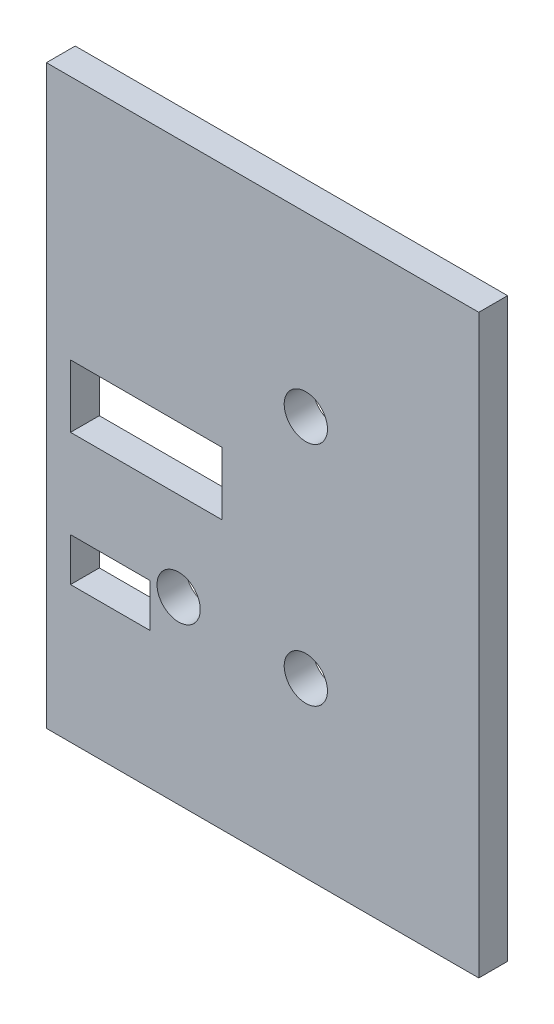
ISO-10303-21;
HEADER;
FILE_DESCRIPTION(('STEP AP214'),'2;1');
FILE_NAME('part.step','',(''),(''),'','','');
FILE_SCHEMA(('AUTOMOTIVE_DESIGN { 1 0 10303 214 1 1 1 1 }'));
ENDSEC;
DATA;
#1=APPLICATION_CONTEXT('core data for automotive mechanical design processes');
#2=APPLICATION_PROTOCOL_DEFINITION('international standard','automotive_design',2000,#1);
#3=PRODUCT_CONTEXT('',#1,'mechanical');
#4=PRODUCT('Part','Part','',(#3));
#5=PRODUCT_RELATED_PRODUCT_CATEGORY('part','',(#4));
#6=PRODUCT_DEFINITION_FORMATION('','',#4);
#7=PRODUCT_DEFINITION_CONTEXT('part definition',#1,'design');
#8=PRODUCT_DEFINITION('design','',#6,#7);
#9=PRODUCT_DEFINITION_SHAPE('','',#8);
#10=(LENGTH_UNIT() NAMED_UNIT(*) SI_UNIT(.MILLI.,.METRE.));
#11=(NAMED_UNIT(*) PLANE_ANGLE_UNIT() SI_UNIT($,.RADIAN.));
#12=(NAMED_UNIT(*) SI_UNIT($,.STERADIAN.) SOLID_ANGLE_UNIT());
#13=UNCERTAINTY_MEASURE_WITH_UNIT(LENGTH_MEASURE(1.E-05),#10,'distance_accuracy_value','');
#14=(GEOMETRIC_REPRESENTATION_CONTEXT(3) GLOBAL_UNCERTAINTY_ASSIGNED_CONTEXT((#13)) GLOBAL_UNIT_ASSIGNED_CONTEXT((#10,
#11,#12)) REPRESENTATION_CONTEXT('',''));
#15=CARTESIAN_POINT('',(0.,0.,0.));
#16=DIRECTION('',(0.,0.,1.));
#17=DIRECTION('',(1.,0.,0.));
#18=AXIS2_PLACEMENT_3D('',#15,#16,#17);
#19=CARTESIAN_POINT('',(0.,0.,2.));
#20=DIRECTION('',(0.,0.,1.));
#21=DIRECTION('',(1.,0.,0.));
#22=AXIS2_PLACEMENT_3D('',#19,#20,#21);
#23=PLANE('',#22);
#24=CARTESIAN_POINT('',(3.,-8.00000000000001,2.));
#25=DIRECTION('',(0.,0.,1.));
#26=DIRECTION('',(1.,0.,0.));
#27=AXIS2_PLACEMENT_3D('',#24,#25,#26);
#28=CIRCLE('',#27,1.5);
#29=CARTESIAN_POINT('',(4.5,-8.00000000000001,2.));
#30=VERTEX_POINT('',#29);
#31=EDGE_CURVE('E324',#30,#30,#28,.T.);
#32=ORIENTED_EDGE('',*,*,#31,.F.);
#33=EDGE_LOOP('',(#32));
#34=FACE_BOUND('',#33,.T.);
#35=CARTESIAN_POINT('',(3.,7.72999999999999,2.));
#36=DIRECTION('',(0.,0.,1.));
#37=DIRECTION('',(1.,0.,0.));
#38=AXIS2_PLACEMENT_3D('',#35,#36,#37);
#39=CIRCLE('',#38,1.5);
#40=CARTESIAN_POINT('',(4.5,7.72999999999999,2.));
#41=VERTEX_POINT('',#40);
#42=EDGE_CURVE('E149',#41,#41,#39,.T.);
#43=ORIENTED_EDGE('',*,*,#42,.F.);
#44=EDGE_LOOP('',(#43));
#45=FACE_BOUND('',#44,.T.);
#46=DIRECTION('',(0.,1.,0.));
#47=VECTOR('',#46,1.);
#48=CARTESIAN_POINT('',(-7.82520706053083,0.,2.));
#49=LINE('',#48,#47);
#50=CARTESIAN_POINT('',(-7.82520706053083,-10.5227139770063,2.));
#51=VERTEX_POINT('',#50);
#52=CARTESIAN_POINT('',(-7.82520706053083,-7.52271397700631,2.));
#53=VERTEX_POINT('',#52);
#54=EDGE_CURVE('E56',#51,#53,#49,.T.);
#55=ORIENTED_EDGE('',*,*,#54,.F.);
#56=DIRECTION('',(-1.,0.,0.));
#57=VECTOR('',#56,1.);
#58=CARTESIAN_POINT('',(0.,-10.5227139770063,2.));
#59=LINE('',#58,#57);
#60=CARTESIAN_POINT('',(-13.3252070605308,-10.5227139770063,2.));
#61=VERTEX_POINT('',#60);
#62=EDGE_CURVE('E143',#51,#61,#59,.T.);
#63=ORIENTED_EDGE('',*,*,#62,.T.);
#64=DIRECTION('',(0.,1.,0.));
#65=VECTOR('',#64,1.);
#66=CARTESIAN_POINT('',(-13.3252070605308,0.,2.));
#67=LINE('',#66,#65);
#68=CARTESIAN_POINT('',(-13.3252070605308,-7.52271397700631,2.));
#69=VERTEX_POINT('',#68);
#70=EDGE_CURVE('E146',#61,#69,#67,.T.);
#71=ORIENTED_EDGE('',*,*,#70,.T.);
#72=DIRECTION('',(-1.,0.,0.));
#73=VECTOR('',#72,1.);
#74=CARTESIAN_POINT('',(0.,-7.52271397700631,2.));
#75=LINE('',#74,#73);
#76=EDGE_CURVE('E155',#53,#69,#75,.T.);
#77=ORIENTED_EDGE('',*,*,#76,.F.);
#78=EDGE_LOOP('',(#55,#63,#71,#77));
#79=FACE_BOUND('',#78,.T.);
#80=CARTESIAN_POINT('',(-5.82520706053083,-7.52271397700631,2.));
#81=DIRECTION('',(0.,0.,1.));
#82=DIRECTION('',(1.,0.,0.));
#83=AXIS2_PLACEMENT_3D('',#80,#81,#82);
#84=CIRCLE('',#83,1.5);
#85=CARTESIAN_POINT('',(-4.32520706053083,-7.52271397700631,2.));
#86=VERTEX_POINT('',#85);
#87=EDGE_CURVE('E162',#86,#86,#84,.T.);
#88=ORIENTED_EDGE('',*,*,#87,.F.);
#89=EDGE_LOOP('',(#88));
#90=FACE_BOUND('',#89,.T.);
#91=DIRECTION('',(0.,-1.,0.));
#92=VECTOR('',#91,1.);
#93=CARTESIAN_POINT('',(-15.,-20.,2.));
#94=LINE('',#93,#92);
#95=CARTESIAN_POINT('',(-15.,20.,2.));
#96=VERTEX_POINT('',#95);
#97=CARTESIAN_POINT('',(-15.,-20.,2.));
#98=VERTEX_POINT('',#97);
#99=EDGE_CURVE('E200',#96,#98,#94,.T.);
#100=ORIENTED_EDGE('',*,*,#99,.T.);
#101=DIRECTION('',(1.,0.,0.));
#102=VECTOR('',#101,1.);
#103=CARTESIAN_POINT('',(15.,-20.,2.));
#104=LINE('',#103,#102);
#105=CARTESIAN_POINT('',(15.,-20.,2.));
#106=VERTEX_POINT('',#105);
#107=EDGE_CURVE('E203',#98,#106,#104,.T.);
#108=ORIENTED_EDGE('',*,*,#107,.T.);
#109=DIRECTION('',(0.,1.,0.));
#110=VECTOR('',#109,1.);
#111=CARTESIAN_POINT('',(15.,-20.,2.));
#112=LINE('',#111,#110);
#113=CARTESIAN_POINT('',(15.,20.,2.));
#114=VERTEX_POINT('',#113);
#115=EDGE_CURVE('E206',#106,#114,#112,.T.);
#116=ORIENTED_EDGE('',*,*,#115,.T.);
#117=DIRECTION('',(-1.,0.,0.));
#118=VECTOR('',#117,1.);
#119=CARTESIAN_POINT('',(15.,20.,2.));
#120=LINE('',#119,#118);
#121=EDGE_CURVE('E208',#114,#96,#120,.T.);
#122=ORIENTED_EDGE('',*,*,#121,.T.);
#123=EDGE_LOOP('',(#100,#108,#116,#122));
#124=FACE_BOUND('',#123,.T.);
#125=DIRECTION('',(0.,1.,0.));
#126=VECTOR('',#125,1.);
#127=CARTESIAN_POINT('',(-2.82520706053083,0.,2.));
#128=LINE('',#127,#126);
#129=CARTESIAN_POINT('',(-2.82520706053083,-1.37627288425088,2.));
#130=VERTEX_POINT('',#129);
#131=CARTESIAN_POINT('',(-2.82520706053083,2.97728602299369,2.));
#132=VERTEX_POINT('',#131);
#133=EDGE_CURVE('E179',#130,#132,#128,.T.);
#134=ORIENTED_EDGE('',*,*,#133,.F.);
#135=DIRECTION('',(-1.,0.,0.));
#136=VECTOR('',#135,1.);
#137=CARTESIAN_POINT('',(0.,-1.37627288425087,2.));
#138=LINE('',#137,#136);
#139=CARTESIAN_POINT('',(-13.3252070605308,-1.37627288425088,2.));
#140=VERTEX_POINT('',#139);
#141=EDGE_CURVE('E48',#130,#140,#138,.T.);
#142=ORIENTED_EDGE('',*,*,#141,.T.);
#143=DIRECTION('',(0.,1.,0.));
#144=VECTOR('',#143,1.);
#145=CARTESIAN_POINT('',(-13.3252070605308,0.,2.));
#146=LINE('',#145,#144);
#147=CARTESIAN_POINT('',(-13.3252070605308,2.97728602299369,2.));
#148=VERTEX_POINT('',#147);
#149=EDGE_CURVE('E169',#140,#148,#146,.T.);
#150=ORIENTED_EDGE('',*,*,#149,.T.);
#151=DIRECTION('',(-1.,0.,0.));
#152=VECTOR('',#151,1.);
#153=CARTESIAN_POINT('',(0.,2.97728602299369,2.));
#154=LINE('',#153,#152);
#155=EDGE_CURVE('E183',#132,#148,#154,.T.);
#156=ORIENTED_EDGE('',*,*,#155,.F.);
#157=EDGE_LOOP('',(#134,#142,#150,#156));
#158=FACE_BOUND('',#157,.T.);
#159=ADVANCED_FACE('F33',(#34,#45,#79,#90,#124,#158),#23,.T.);
#160=CARTESIAN_POINT('',(0.,0.,0.));
#161=DIRECTION('',(0.,0.,1.));
#162=DIRECTION('',(1.,0.,0.));
#163=AXIS2_PLACEMENT_3D('',#160,#161,#162);
#164=PLANE('',#163);
#165=CARTESIAN_POINT('',(3.,-8.00000000000001,0.));
#166=DIRECTION('',(0.,0.,1.));
#167=DIRECTION('',(1.,0.,0.));
#168=AXIS2_PLACEMENT_3D('',#165,#166,#167);
#169=CIRCLE('',#168,1.5);
#170=CARTESIAN_POINT('',(4.5,-8.00000000000001,0.));
#171=VERTEX_POINT('',#170);
#172=EDGE_CURVE('E180',#171,#171,#169,.T.);
#173=ORIENTED_EDGE('',*,*,#172,.T.);
#174=EDGE_LOOP('',(#173));
#175=FACE_BOUND('',#174,.T.);
#176=CARTESIAN_POINT('',(3.,7.72999999999999,0.));
#177=DIRECTION('',(0.,0.,1.));
#178=DIRECTION('',(1.,0.,0.));
#179=AXIS2_PLACEMENT_3D('',#176,#177,#178);
#180=CIRCLE('',#179,1.5);
#181=CARTESIAN_POINT('',(4.5,7.72999999999999,0.));
#182=VERTEX_POINT('',#181);
#183=EDGE_CURVE('E325',#182,#182,#180,.T.);
#184=ORIENTED_EDGE('',*,*,#183,.T.);
#185=EDGE_LOOP('',(#184));
#186=FACE_BOUND('',#185,.T.);
#187=DIRECTION('',(0.,-1.,0.));
#188=VECTOR('',#187,1.);
#189=CARTESIAN_POINT('',(-15.,-20.,0.));
#190=LINE('',#189,#188);
#191=CARTESIAN_POINT('',(-15.,20.,0.));
#192=VERTEX_POINT('',#191);
#193=CARTESIAN_POINT('',(-15.,-20.,0.));
#194=VERTEX_POINT('',#193);
#195=EDGE_CURVE('E197',#192,#194,#190,.T.);
#196=ORIENTED_EDGE('',*,*,#195,.F.);
#197=DIRECTION('',(-1.,0.,0.));
#198=VECTOR('',#197,1.);
#199=CARTESIAN_POINT('',(15.,20.,0.));
#200=LINE('',#199,#198);
#201=CARTESIAN_POINT('',(15.,20.,0.));
#202=VERTEX_POINT('',#201);
#203=EDGE_CURVE('E204',#202,#192,#200,.T.);
#204=ORIENTED_EDGE('',*,*,#203,.F.);
#205=DIRECTION('',(0.,1.,0.));
#206=VECTOR('',#205,1.);
#207=CARTESIAN_POINT('',(15.,-20.,0.));
#208=LINE('',#207,#206);
#209=CARTESIAN_POINT('',(15.,-20.,0.));
#210=VERTEX_POINT('',#209);
#211=EDGE_CURVE('E215',#210,#202,#208,.T.);
#212=ORIENTED_EDGE('',*,*,#211,.F.);
#213=DIRECTION('',(1.,0.,0.));
#214=VECTOR('',#213,1.);
#215=CARTESIAN_POINT('',(15.,-20.,0.));
#216=LINE('',#215,#214);
#217=EDGE_CURVE('E213',#194,#210,#216,.T.);
#218=ORIENTED_EDGE('',*,*,#217,.F.);
#219=EDGE_LOOP('',(#196,#204,#212,#218));
#220=FACE_BOUND('',#219,.T.);
#221=CARTESIAN_POINT('',(-5.82520706053083,-7.52271397700631,0.));
#222=DIRECTION('',(0.,0.,1.));
#223=DIRECTION('',(1.,0.,0.));
#224=AXIS2_PLACEMENT_3D('',#221,#222,#223);
#225=CIRCLE('',#224,1.5);
#226=CARTESIAN_POINT('',(-4.32520706053083,-7.52271397700631,0.));
#227=VERTEX_POINT('',#226);
#228=EDGE_CURVE('E194',#227,#227,#225,.T.);
#229=ORIENTED_EDGE('',*,*,#228,.T.);
#230=EDGE_LOOP('',(#229));
#231=FACE_BOUND('',#230,.T.);
#232=DIRECTION('',(-1.,0.,0.));
#233=VECTOR('',#232,1.);
#234=CARTESIAN_POINT('',(0.,-10.5227139770063,0.));
#235=LINE('',#234,#233);
#236=CARTESIAN_POINT('',(-7.82520706053083,-10.5227139770063,0.));
#237=VERTEX_POINT('',#236);
#238=CARTESIAN_POINT('',(-13.3252070605308,-10.5227139770063,0.));
#239=VERTEX_POINT('',#238);
#240=EDGE_CURVE('E131',#237,#239,#235,.T.);
#241=ORIENTED_EDGE('',*,*,#240,.F.);
#242=DIRECTION('',(0.,1.,0.));
#243=VECTOR('',#242,1.);
#244=CARTESIAN_POINT('',(-7.82520706053083,0.,0.));
#245=LINE('',#244,#243);
#246=CARTESIAN_POINT('',(-7.82520706053083,-7.52271397700631,0.));
#247=VERTEX_POINT('',#246);
#248=EDGE_CURVE('E125',#237,#247,#245,.T.);
#249=ORIENTED_EDGE('',*,*,#248,.T.);
#250=DIRECTION('',(-1.,0.,0.));
#251=VECTOR('',#250,1.);
#252=CARTESIAN_POINT('',(0.,-7.52271397700631,0.));
#253=LINE('',#252,#251);
#254=CARTESIAN_POINT('',(-13.3252070605308,-7.52271397700631,0.));
#255=VERTEX_POINT('',#254);
#256=EDGE_CURVE('E134',#247,#255,#253,.T.);
#257=ORIENTED_EDGE('',*,*,#256,.T.);
#258=DIRECTION('',(0.,1.,0.));
#259=VECTOR('',#258,1.);
#260=CARTESIAN_POINT('',(-13.3252070605308,0.,0.));
#261=LINE('',#260,#259);
#262=EDGE_CURVE('E139',#239,#255,#261,.T.);
#263=ORIENTED_EDGE('',*,*,#262,.F.);
#264=EDGE_LOOP('',(#241,#249,#257,#263));
#265=FACE_BOUND('',#264,.T.);
#266=DIRECTION('',(-1.,0.,0.));
#267=VECTOR('',#266,1.);
#268=CARTESIAN_POINT('',(0.,-1.37627288425087,0.));
#269=LINE('',#268,#267);
#270=CARTESIAN_POINT('',(-2.82520706053083,-1.37627288425088,0.));
#271=VERTEX_POINT('',#270);
#272=CARTESIAN_POINT('',(-13.3252070605308,-1.37627288425088,0.));
#273=VERTEX_POINT('',#272);
#274=EDGE_CURVE('E166',#271,#273,#269,.T.);
#275=ORIENTED_EDGE('',*,*,#274,.F.);
#276=DIRECTION('',(0.,1.,0.));
#277=VECTOR('',#276,1.);
#278=CARTESIAN_POINT('',(-2.82520706053083,0.,0.));
#279=LINE('',#278,#277);
#280=CARTESIAN_POINT('',(-2.82520706053083,2.97728602299369,0.));
#281=VERTEX_POINT('',#280);
#282=EDGE_CURVE('E168',#271,#281,#279,.T.);
#283=ORIENTED_EDGE('',*,*,#282,.T.);
#284=DIRECTION('',(-1.,0.,0.));
#285=VECTOR('',#284,1.);
#286=CARTESIAN_POINT('',(0.,2.97728602299369,0.));
#287=LINE('',#286,#285);
#288=CARTESIAN_POINT('',(-13.3252070605308,2.97728602299369,0.));
#289=VERTEX_POINT('',#288);
#290=EDGE_CURVE('E172',#281,#289,#287,.T.);
#291=ORIENTED_EDGE('',*,*,#290,.T.);
#292=DIRECTION('',(0.,1.,0.));
#293=VECTOR('',#292,1.);
#294=CARTESIAN_POINT('',(-13.3252070605308,0.,0.));
#295=LINE('',#294,#293);
#296=EDGE_CURVE('E175',#273,#289,#295,.T.);
#297=ORIENTED_EDGE('',*,*,#296,.F.);
#298=EDGE_LOOP('',(#275,#283,#291,#297));
#299=FACE_BOUND('',#298,.T.);
#300=ADVANCED_FACE('F141',(#175,#186,#220,#231,#265,#299),#164,.F.);
#301=CARTESIAN_POINT('',(-15.,-20.,2.));
#302=DIRECTION('',(1.,0.,0.));
#303=DIRECTION('',(0.,1.,0.));
#304=AXIS2_PLACEMENT_3D('',#301,#302,#303);
#305=PLANE('',#304);
#306=ORIENTED_EDGE('',*,*,#195,.T.);
#307=DIRECTION('',(0.,0.,-1.));
#308=VECTOR('',#307,1.);
#309=CARTESIAN_POINT('',(-15.,-20.,2.));
#310=LINE('',#309,#308);
#311=EDGE_CURVE('E11',#98,#194,#310,.T.);
#312=ORIENTED_EDGE('',*,*,#311,.F.);
#313=ORIENTED_EDGE('',*,*,#99,.F.);
#314=DIRECTION('',(0.,0.,-1.));
#315=VECTOR('',#314,1.);
#316=CARTESIAN_POINT('',(-15.,20.,2.));
#317=LINE('',#316,#315);
#318=EDGE_CURVE('E210',#96,#192,#317,.T.);
#319=ORIENTED_EDGE('',*,*,#318,.T.);
#320=EDGE_LOOP('',(#306,#312,#313,#319));
#321=FACE_BOUND('',#320,.T.);
#322=ADVANCED_FACE('F35',(#321),#305,.F.);
#323=CARTESIAN_POINT('',(15.,-20.,2.));
#324=DIRECTION('',(0.,1.,0.));
#325=DIRECTION('',(-1.,0.,0.));
#326=AXIS2_PLACEMENT_3D('',#323,#324,#325);
#327=PLANE('',#326);
#328=ORIENTED_EDGE('',*,*,#217,.T.);
#329=DIRECTION('',(0.,0.,-1.));
#330=VECTOR('',#329,1.);
#331=CARTESIAN_POINT('',(15.,-20.,2.));
#332=LINE('',#331,#330);
#333=EDGE_CURVE('E41',#106,#210,#332,.T.);
#334=ORIENTED_EDGE('',*,*,#333,.F.);
#335=ORIENTED_EDGE('',*,*,#107,.F.);
#336=ORIENTED_EDGE('',*,*,#311,.T.);
#337=EDGE_LOOP('',(#328,#334,#335,#336));
#338=FACE_BOUND('',#337,.T.);
#339=ADVANCED_FACE('F243',(#338),#327,.F.);
#340=CARTESIAN_POINT('',(15.,-20.,2.));
#341=DIRECTION('',(-1.,0.,0.));
#342=DIRECTION('',(0.,-1.,0.));
#343=AXIS2_PLACEMENT_3D('',#340,#341,#342);
#344=PLANE('',#343);
#345=ORIENTED_EDGE('',*,*,#211,.T.);
#346=DIRECTION('',(0.,0.,-1.));
#347=VECTOR('',#346,1.);
#348=CARTESIAN_POINT('',(15.,20.,2.));
#349=LINE('',#348,#347);
#350=EDGE_CURVE('E220',#114,#202,#349,.T.);
#351=ORIENTED_EDGE('',*,*,#350,.F.);
#352=ORIENTED_EDGE('',*,*,#115,.F.);
#353=ORIENTED_EDGE('',*,*,#333,.T.);
#354=EDGE_LOOP('',(#345,#351,#352,#353));
#355=FACE_BOUND('',#354,.T.);
#356=ADVANCED_FACE('F227',(#355),#344,.F.);
#357=CARTESIAN_POINT('',(15.,20.,2.));
#358=DIRECTION('',(0.,-1.,0.));
#359=DIRECTION('',(0.,0.,-1.));
#360=AXIS2_PLACEMENT_3D('',#357,#358,#359);
#361=PLANE('',#360);
#362=ORIENTED_EDGE('',*,*,#203,.T.);
#363=ORIENTED_EDGE('',*,*,#318,.F.);
#364=ORIENTED_EDGE('',*,*,#121,.F.);
#365=ORIENTED_EDGE('',*,*,#350,.T.);
#366=EDGE_LOOP('',(#362,#363,#364,#365));
#367=FACE_BOUND('',#366,.T.);
#368=ADVANCED_FACE('F236',(#367),#361,.F.);
#369=CARTESIAN_POINT('',(-5.82520706053083,-7.52271397700631,0.));
#370=DIRECTION('',(0.,0.,1.));
#371=DIRECTION('',(1.,0.,0.));
#372=AXIS2_PLACEMENT_3D('',#369,#370,#371);
#373=CYLINDRICAL_SURFACE('',#372,1.5);
#374=ORIENTED_EDGE('',*,*,#228,.F.);
#375=EDGE_LOOP('',(#374));
#376=FACE_BOUND('',#375,.T.);
#377=ORIENTED_EDGE('',*,*,#87,.T.);
#378=EDGE_LOOP('',(#377));
#379=FACE_BOUND('',#378,.T.);
#380=ADVANCED_FACE('F261',(#376,#379),#373,.F.);
#381=CARTESIAN_POINT('',(-7.82520706053083,0.,0.));
#382=DIRECTION('',(1.,0.,0.));
#383=DIRECTION('',(0.,0.,-1.));
#384=AXIS2_PLACEMENT_3D('',#381,#382,#383);
#385=PLANE('',#384);
#386=ORIENTED_EDGE('',*,*,#54,.T.);
#387=DIRECTION('',(0.,0.,1.));
#388=VECTOR('',#387,1.);
#389=CARTESIAN_POINT('',(-7.82520706053083,-7.52271397700631,0.));
#390=LINE('',#389,#388);
#391=EDGE_CURVE('E121',#247,#53,#390,.T.);
#392=ORIENTED_EDGE('',*,*,#391,.F.);
#393=ORIENTED_EDGE('',*,*,#248,.F.);
#394=DIRECTION('',(0.,0.,1.));
#395=VECTOR('',#394,1.);
#396=CARTESIAN_POINT('',(-7.82520706053083,-10.5227139770063,0.));
#397=LINE('',#396,#395);
#398=EDGE_CURVE('E160',#237,#51,#397,.T.);
#399=ORIENTED_EDGE('',*,*,#398,.T.);
#400=EDGE_LOOP('',(#386,#392,#393,#399));
#401=FACE_BOUND('',#400,.T.);
#402=ADVANCED_FACE('F123',(#401),#385,.F.);
#403=CARTESIAN_POINT('',(0.,-10.5227139770063,0.));
#404=DIRECTION('',(0.,1.,0.));
#405=DIRECTION('',(-1.,0.,0.));
#406=AXIS2_PLACEMENT_3D('',#403,#404,#405);
#407=PLANE('',#406);
#408=ORIENTED_EDGE('',*,*,#62,.F.);
#409=ORIENTED_EDGE('',*,*,#398,.F.);
#410=ORIENTED_EDGE('',*,*,#240,.T.);
#411=DIRECTION('',(0.,0.,1.));
#412=VECTOR('',#411,1.);
#413=CARTESIAN_POINT('',(-13.3252070605308,-10.5227139770063,0.));
#414=LINE('',#413,#412);
#415=EDGE_CURVE('E163',#239,#61,#414,.T.);
#416=ORIENTED_EDGE('',*,*,#415,.T.);
#417=EDGE_LOOP('',(#408,#409,#410,#416));
#418=FACE_BOUND('',#417,.T.);
#419=ADVANCED_FACE('F272',(#418),#407,.T.);
#420=CARTESIAN_POINT('',(-13.3252070605308,0.,0.));
#421=DIRECTION('',(1.,0.,0.));
#422=DIRECTION('',(0.,0.,-1.));
#423=AXIS2_PLACEMENT_3D('',#420,#421,#422);
#424=PLANE('',#423);
#425=ORIENTED_EDGE('',*,*,#70,.F.);
#426=ORIENTED_EDGE('',*,*,#415,.F.);
#427=ORIENTED_EDGE('',*,*,#262,.T.);
#428=DIRECTION('',(0.,0.,1.));
#429=VECTOR('',#428,1.);
#430=CARTESIAN_POINT('',(-13.3252070605308,-7.52271397700631,0.));
#431=LINE('',#430,#429);
#432=EDGE_CURVE('E130',#255,#69,#431,.T.);
#433=ORIENTED_EDGE('',*,*,#432,.T.);
#434=EDGE_LOOP('',(#425,#426,#427,#433));
#435=FACE_BOUND('',#434,.T.);
#436=ADVANCED_FACE('F281',(#435),#424,.T.);
#437=CARTESIAN_POINT('',(0.,-7.52271397700631,0.));
#438=DIRECTION('',(0.,1.,0.));
#439=DIRECTION('',(0.,0.,1.));
#440=AXIS2_PLACEMENT_3D('',#437,#438,#439);
#441=PLANE('',#440);
#442=ORIENTED_EDGE('',*,*,#76,.T.);
#443=ORIENTED_EDGE('',*,*,#432,.F.);
#444=ORIENTED_EDGE('',*,*,#256,.F.);
#445=ORIENTED_EDGE('',*,*,#391,.T.);
#446=EDGE_LOOP('',(#442,#443,#444,#445));
#447=FACE_BOUND('',#446,.T.);
#448=ADVANCED_FACE('F135',(#447),#441,.F.);
#449=CARTESIAN_POINT('',(0.,-1.37627288425087,0.));
#450=DIRECTION('',(0.,1.,0.));
#451=DIRECTION('',(-1.,0.,0.));
#452=AXIS2_PLACEMENT_3D('',#449,#450,#451);
#453=PLANE('',#452);
#454=ORIENTED_EDGE('',*,*,#141,.F.);
#455=DIRECTION('',(0.,0.,1.));
#456=VECTOR('',#455,1.);
#457=CARTESIAN_POINT('',(-2.82520706053083,-1.37627288425088,0.));
#458=LINE('',#457,#456);
#459=EDGE_CURVE('E177',#271,#130,#458,.T.);
#460=ORIENTED_EDGE('',*,*,#459,.F.);
#461=ORIENTED_EDGE('',*,*,#274,.T.);
#462=DIRECTION('',(0.,0.,1.));
#463=VECTOR('',#462,1.);
#464=CARTESIAN_POINT('',(-13.3252070605308,-1.37627288425088,0.));
#465=LINE('',#464,#463);
#466=EDGE_CURVE('E156',#273,#140,#465,.T.);
#467=ORIENTED_EDGE('',*,*,#466,.T.);
#468=EDGE_LOOP('',(#454,#460,#461,#467));
#469=FACE_BOUND('',#468,.T.);
#470=ADVANCED_FACE('F291',(#469),#453,.T.);
#471=CARTESIAN_POINT('',(-13.3252070605308,0.,0.));
#472=DIRECTION('',(1.,0.,0.));
#473=DIRECTION('',(0.,0.,-1.));
#474=AXIS2_PLACEMENT_3D('',#471,#472,#473);
#475=PLANE('',#474);
#476=ORIENTED_EDGE('',*,*,#149,.F.);
#477=ORIENTED_EDGE('',*,*,#466,.F.);
#478=ORIENTED_EDGE('',*,*,#296,.T.);
#479=DIRECTION('',(0.,0.,1.));
#480=VECTOR('',#479,1.);
#481=CARTESIAN_POINT('',(-13.3252070605308,2.97728602299369,0.));
#482=LINE('',#481,#480);
#483=EDGE_CURVE('E189',#289,#148,#482,.T.);
#484=ORIENTED_EDGE('',*,*,#483,.T.);
#485=EDGE_LOOP('',(#476,#477,#478,#484));
#486=FACE_BOUND('',#485,.T.);
#487=ADVANCED_FACE('F287',(#486),#475,.T.);
#488=CARTESIAN_POINT('',(0.,2.97728602299369,0.));
#489=DIRECTION('',(0.,1.,0.));
#490=DIRECTION('',(-1.,0.,0.));
#491=AXIS2_PLACEMENT_3D('',#488,#489,#490);
#492=PLANE('',#491);
#493=ORIENTED_EDGE('',*,*,#155,.T.);
#494=ORIENTED_EDGE('',*,*,#483,.F.);
#495=ORIENTED_EDGE('',*,*,#290,.F.);
#496=DIRECTION('',(0.,0.,1.));
#497=VECTOR('',#496,1.);
#498=CARTESIAN_POINT('',(-2.82520706053083,2.97728602299369,0.));
#499=LINE('',#498,#497);
#500=EDGE_CURVE('E191',#281,#132,#499,.T.);
#501=ORIENTED_EDGE('',*,*,#500,.T.);
#502=EDGE_LOOP('',(#493,#494,#495,#501));
#503=FACE_BOUND('',#502,.T.);
#504=ADVANCED_FACE('F290',(#503),#492,.F.);
#505=CARTESIAN_POINT('',(-2.82520706053083,0.,0.));
#506=DIRECTION('',(1.,0.,0.));
#507=DIRECTION('',(0.,0.,-1.));
#508=AXIS2_PLACEMENT_3D('',#505,#506,#507);
#509=PLANE('',#508);
#510=ORIENTED_EDGE('',*,*,#133,.T.);
#511=ORIENTED_EDGE('',*,*,#500,.F.);
#512=ORIENTED_EDGE('',*,*,#282,.F.);
#513=ORIENTED_EDGE('',*,*,#459,.T.);
#514=EDGE_LOOP('',(#510,#511,#512,#513));
#515=FACE_BOUND('',#514,.T.);
#516=ADVANCED_FACE('F295',(#515),#509,.F.);
#517=CARTESIAN_POINT('',(3.,7.72999999999999,0.));
#518=DIRECTION('',(0.,0.,1.));
#519=DIRECTION('',(1.,0.,0.));
#520=AXIS2_PLACEMENT_3D('',#517,#518,#519);
#521=CYLINDRICAL_SURFACE('',#520,1.5);
#522=ORIENTED_EDGE('',*,*,#183,.F.);
#523=EDGE_LOOP('',(#522));
#524=FACE_BOUND('',#523,.T.);
#525=ORIENTED_EDGE('',*,*,#42,.T.);
#526=EDGE_LOOP('',(#525));
#527=FACE_BOUND('',#526,.T.);
#528=ADVANCED_FACE('F298',(#524,#527),#521,.F.);
#529=CARTESIAN_POINT('',(3.,-8.00000000000001,0.));
#530=DIRECTION('',(0.,0.,1.));
#531=DIRECTION('',(1.,0.,0.));
#532=AXIS2_PLACEMENT_3D('',#529,#530,#531);
#533=CYLINDRICAL_SURFACE('',#532,1.5);
#534=ORIENTED_EDGE('',*,*,#172,.F.);
#535=EDGE_LOOP('',(#534));
#536=FACE_BOUND('',#535,.T.);
#537=ORIENTED_EDGE('',*,*,#31,.T.);
#538=EDGE_LOOP('',(#537));
#539=FACE_BOUND('',#538,.T.);
#540=ADVANCED_FACE('F314',(#536,#539),#533,.F.);
#541=CLOSED_SHELL('',(#159,#300,#322,#339,#356,#368,#380,#402,#419,#436,#448,#470,#487,#504,
#516,#528,#540));
#542=MANIFOLD_SOLID_BREP('B2',#541);
#543=ADVANCED_BREP_SHAPE_REPRESENTATION('',(#18,#542),#14);
#544=SHAPE_DEFINITION_REPRESENTATION(#9,#543);
ENDSEC;
END-ISO-10303-21;
